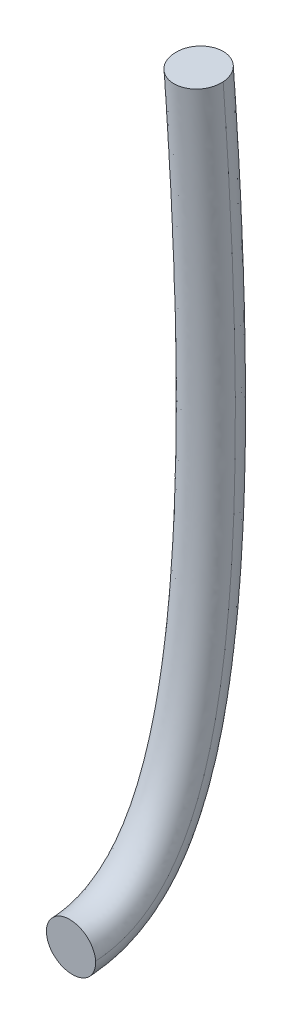
ISO-10303-21;
HEADER;
FILE_DESCRIPTION(('STEP AP214'),'2;1');
FILE_NAME('part.step','',(''),(''),'','','');
FILE_SCHEMA(('AUTOMOTIVE_DESIGN { 1 0 10303 214 1 1 1 1 }'));
ENDSEC;
DATA;
#1=APPLICATION_CONTEXT('core data for automotive mechanical design processes');
#2=APPLICATION_PROTOCOL_DEFINITION('international standard','automotive_design',2000,#1);
#3=PRODUCT_CONTEXT('',#1,'mechanical');
#4=PRODUCT('Part','Part','',(#3));
#5=PRODUCT_RELATED_PRODUCT_CATEGORY('part','',(#4));
#6=PRODUCT_DEFINITION_FORMATION('','',#4);
#7=PRODUCT_DEFINITION_CONTEXT('part definition',#1,'design');
#8=PRODUCT_DEFINITION('design','',#6,#7);
#9=PRODUCT_DEFINITION_SHAPE('','',#8);
#10=(LENGTH_UNIT() NAMED_UNIT(*) SI_UNIT(.MILLI.,.METRE.));
#11=(NAMED_UNIT(*) PLANE_ANGLE_UNIT() SI_UNIT($,.RADIAN.));
#12=(NAMED_UNIT(*) SI_UNIT($,.STERADIAN.) SOLID_ANGLE_UNIT());
#13=UNCERTAINTY_MEASURE_WITH_UNIT(LENGTH_MEASURE(1.E-05),#10,'distance_accuracy_value','');
#14=(GEOMETRIC_REPRESENTATION_CONTEXT(3) GLOBAL_UNCERTAINTY_ASSIGNED_CONTEXT((#13)) GLOBAL_UNIT_ASSIGNED_CONTEXT((#10,
#11,#12)) REPRESENTATION_CONTEXT('',''));
#15=CARTESIAN_POINT('',(0.,0.,0.));
#16=DIRECTION('',(0.,0.,1.));
#17=DIRECTION('',(1.,0.,0.));
#18=AXIS2_PLACEMENT_3D('',#15,#16,#17);
#19=CARTESIAN_POINT('',(-17.555,-7.38568943191456,11.1672900449514));
#20=CARTESIAN_POINT('',(-17.5550000000002,-7.37642950308164,10.9994364502612));
#21=CARTESIAN_POINT('',(-17.5550000000004,-7.27630738479391,10.6948035976056));
#22=CARTESIAN_POINT('',(-17.5550000000003,-6.87049354697238,10.3351990877175));
#23=CARTESIAN_POINT('',(-17.5549999999999,-6.18722129795571,10.0812514068247));
#24=CARTESIAN_POINT('',(-17.5549999999994,-5.06638830404402,9.90823800900155));
#25=CARTESIAN_POINT('',(-17.5549999999991,-3.38099110822586,9.86452211553343));
#26=CARTESIAN_POINT('',(-17.5549999999996,-1.83527381521949,9.93899557759439));
#27=CARTESIAN_POINT('',(-17.555,-1.00000001490137,10.0000001490162));
#28=CARTESIAN_POINT('',(-17.554999999999,-7.43610265920569,11.1645089135862));
#29=CARTESIAN_POINT('',(-17.5549999999992,-7.42638032085317,10.9882732782254));
#30=CARTESIAN_POINT('',(-17.5549999999994,-7.31962413810839,10.6638682837785));
#31=CARTESIAN_POINT('',(-17.5549999999992,-6.89389475712469,10.2891962403215));
#32=CARTESIAN_POINT('',(-17.5549999999989,-6.19822098452051,10.0317119787701));
#33=CARTESIAN_POINT('',(-17.5549999999984,-5.0694669059248,9.85763886137456));
#34=CARTESIAN_POINT('',(-17.5549999999981,-3.37989821810454,9.81402459070275));
#35=CARTESIAN_POINT('',(-17.5549999999985,-1.83238214013708,9.88858240859414));
#36=CARTESIAN_POINT('',(-17.554999999999,-0.996322261093757,9.94964439160444));
#37=CARTESIAN_POINT('',(-17.5785391100475,-7.50310010667755,11.1608128855284));
#38=CARTESIAN_POINT('',(-17.5785391100477,-7.49276364502284,10.9734451123601));
#39=CARTESIAN_POINT('',(-17.5785391100479,-7.37718524159239,10.6227654868779));
#40=CARTESIAN_POINT('',(-17.5785391100478,-6.92499936885807,10.2280770185193));
#41=CARTESIAN_POINT('',(-17.5785391100474,-6.21284579313548,9.9658864565508));
#42=CARTESIAN_POINT('',(-17.5785391100469,-5.0735639722797,9.79040143480988));
#43=CARTESIAN_POINT('',(-17.5785391100466,-3.37845106722099,9.74691896417055));
#44=CARTESIAN_POINT('',(-17.5785391100471,-1.82853851807828,9.82158508863255));
#45=CARTESIAN_POINT('',(-17.5785391100475,-0.991434652607267,9.88272331962833));
#46=CARTESIAN_POINT('',(-17.6505190833483,-7.57470774680984,11.1568625283572));
#47=CARTESIAN_POINT('',(-17.6505190833485,-7.56371553905938,10.9576081261052));
#48=CARTESIAN_POINT('',(-17.6505190833487,-7.43869873059526,10.5788488181541));
#49=CARTESIAN_POINT('',(-17.6505190833486,-6.9582525501853,10.1627788869149));
#50=CARTESIAN_POINT('',(-17.6505190833482,-6.22848737405222,9.89554822758815));
#51=CARTESIAN_POINT('',(-17.6505190833477,-5.07795197296071,9.7185485083637));
#52=CARTESIAN_POINT('',(-17.6505190833474,-3.37691263866721,9.67520177446663));
#53=CARTESIAN_POINT('',(-17.6505190833479,-1.82442932968597,9.74997766374041));
#54=CARTESIAN_POINT('',(-17.6505190833483,-0.986210720609659,9.81119731050171));
#55=CARTESIAN_POINT('',(-17.7438355847652,-7.61993836278091,11.1543673045539));
#56=CARTESIAN_POINT('',(-17.7438355847654,-7.60853107845988,10.9475888601949));
#57=CARTESIAN_POINT('',(-17.7438355847656,-7.47756512784935,10.5510890938704));
#58=CARTESIAN_POINT('',(-17.7438355847654,-6.97924541995067,10.1214966590491));
#59=CARTESIAN_POINT('',(-17.7438355847651,-6.23835292294597,9.85109617979233));
#60=CARTESIAN_POINT('',(-17.7438355847646,-5.08071119710778,9.67314749113105));
#61=CARTESIAN_POINT('',(-17.7438355847643,-3.37592943759194,9.62989357908475));
#62=CARTESIAN_POINT('',(-17.7438355847647,-1.82183527306593,9.70474707474506));
#63=CARTESIAN_POINT('',(-17.7438355847652,-0.982911049490704,9.76601825635647));
#64=CARTESIAN_POINT('',(-17.8850524391054,-7.60399735618256,11.1552467172762));
#65=CARTESIAN_POINT('',(-17.8850524391056,-7.59273655491606,10.9511235532875));
#66=CARTESIAN_POINT('',(-17.8850524391058,-7.46386452825342,10.5608771048295));
#67=CARTESIAN_POINT('',(-17.8850524391056,-6.9718492341243,10.1360542810496));
#68=CARTESIAN_POINT('',(-17.8850524391053,-6.23487910467969,9.86676793089808));
#69=CARTESIAN_POINT('',(-17.8850524391048,-5.07974149068369,9.68915197447507));
#70=CARTESIAN_POINT('',(-17.8850524391045,-3.37627848998266,9.64586378164126));
#71=CARTESIAN_POINT('',(-17.8850524391049,-1.82274918826266,9.72068809593831));
#72=CARTESIAN_POINT('',(-17.8850524391054,-0.984073980349695,9.78194109058665));
#73=CARTESIAN_POINT('',(-18.0119035373636,-7.47839292780554,11.1621758990434));
#74=CARTESIAN_POINT('',(-18.0119035373638,-7.46828329459383,10.9789198172507));
#75=CARTESIAN_POINT('',(-18.011903537364,-7.35595326720523,10.6379313313682));
#76=CARTESIAN_POINT('',(-18.0119035373639,-6.9135332397705,10.2506313244691));
#77=CARTESIAN_POINT('',(-18.0119035373635,-6.20745827499399,9.99017081405779));
#78=CARTESIAN_POINT('',(-18.011903537363,-5.07205807033013,9.81520333893958));
#79=CARTESIAN_POINT('',(-18.0119035373627,-3.3789893577195,9.77166941158744));
#80=CARTESIAN_POINT('',(-18.0119035373632,-1.82995536034777,9.84629226435053));
#81=CARTESIAN_POINT('',(-18.0119035373636,-0.993237094665954,9.90740233290438));
#82=CARTESIAN_POINT('',(-18.0119944293773,-7.3485287545302,11.1693400768776));
#83=CARTESIAN_POINT('',(-18.0119944293774,-7.33960959603295,11.0076635842821));
#84=CARTESIAN_POINT('',(-18.0119944293776,-7.24437876067712,10.717604825608));
#85=CARTESIAN_POINT('',(-18.0119944293775,-6.85324295469975,10.3691053368339));
#86=CARTESIAN_POINT('',(-18.0119944293771,-6.17911185334965,10.1177658240285));
#87=CARTESIAN_POINT('',(-18.0119944293766,-5.06411784279511,9.94553429265505));
#88=CARTESIAN_POINT('',(-18.0119944293764,-3.38179563445548,9.90174415021061));
#89=CARTESIAN_POINT('',(-18.0119944293768,-1.83740547018542,9.976156201868));
#90=CARTESIAN_POINT('',(-18.0119944293772,-1.00271096657219,10.0371184641126));
#91=CARTESIAN_POINT('',(-17.9828948609528,-7.28816581524924,11.1726701010151));
#92=CARTESIAN_POINT('',(-17.9828948609529,-7.27979984538482,11.0210211909464));
#93=CARTESIAN_POINT('',(-17.9828948609531,-7.19251932348195,10.7546346271501));
#94=CARTESIAN_POINT('',(-17.982894860953,-6.82521696261271,10.4241670798163));
#95=CARTESIAN_POINT('',(-17.9828948609526,-6.16593331407854,10.1770697024865));
#96=CARTESIAN_POINT('',(-17.9828948609521,-5.06042478911119,10.0061113265432));
#97=CARTESIAN_POINT('',(-17.9828948609519,-3.38309790841542,9.96220340685519));
#98=CARTESIAN_POINT('',(-17.9828948609523,-1.84086867718057,10.0365190113268));
#99=CARTESIAN_POINT('',(-17.9828948609527,-1.0071145733577,10.0974125910793));
#100=B_SPLINE_SURFACE_WITH_KNOTS('',3,3,((#19,#20,#21,#22,#23,#24,#25,#26,#27),(#28,#29,#30,#31,
#32,#33,#34,#35,#36),(#37,#38,#39,#40,#41,#42,#43,#44,#45),(#46,#47,#48,#49,#50,#51,#52,#53,
#54),(#55,#56,#57,#58,#59,#60,#61,#62,#63),(#64,#65,#66,#67,#68,#69,#70,#71,#72),(#73,#74,#75,
#76,#77,#78,#79,#80,#81),(#82,#83,#84,#85,#86,#87,#88,#89,#90),(#91,#92,#93,#94,#95,#96,#97,#98,
#99)),.UNSPECIFIED.,.F.,.F.,.F.,(4,1,1,1,1,1,4),(4,1,1,1,1,1,4),(-3.14159265358979,
-2.46839422782055,-2.24399475256414,-1.79519580205131,-1.12199737628207,-0.448798950512828,
0.448798950512828),(0.,0.142857142857143,0.285714285714286,0.428571428571429,0.571428571428571,
0.785714285714286,1.),.UNSPECIFIED.);
#101=CARTESIAN_POINT('',(-17.555,-7.38568943191456,11.1672900449514));
#102=CARTESIAN_POINT('',(-17.5550000000002,-7.37642950308164,10.9994364502612));
#103=CARTESIAN_POINT('',(-17.5550000000004,-7.27630738479391,10.6948035976056));
#104=CARTESIAN_POINT('',(-17.5550000000003,-6.87049354697238,10.3351990877175));
#105=CARTESIAN_POINT('',(-17.5549999999999,-6.18722129795571,10.0812514068247));
#106=CARTESIAN_POINT('',(-17.5549999999994,-5.06638830404402,9.90823800900155));
#107=CARTESIAN_POINT('',(-17.5549999999991,-3.38099110822586,9.86452211553343));
#108=CARTESIAN_POINT('',(-17.5549999999996,-1.83527381521949,9.93899557759439));
#109=CARTESIAN_POINT('',(-17.555,-1.00000001490137,10.0000001490162));
#110=B_SPLINE_CURVE_WITH_KNOTS('',3,(#101,#102,#103,#104,#105,#106,#107,#108,#109),
.UNSPECIFIED.,.F.,.F.,(4,1,1,1,1,1,4),(0.,0.142857142857143,0.285714285714286,0.428571428571429,
0.571428571428571,0.785714285714286,1.),.UNSPECIFIED.);
#111=CARTESIAN_POINT('',(-17.555,-7.38568943191456,11.1672900449514));
#112=VERTEX_POINT('',#111);
#113=CARTESIAN_POINT('',(-17.555,-1.00000001490137,10.0000001490162));
#114=VERTEX_POINT('',#113);
#115=EDGE_CURVE('E11',#112,#114,#110,.T.);
#116=CARTESIAN_POINT('',(-17.555,-7.38568943191456,11.1672900449514));
#117=CARTESIAN_POINT('',(-17.5549787274771,-7.41102471275125,11.1658923811246));
#118=CARTESIAN_POINT('',(-17.5594742792876,-7.43643253137826,11.1644907156271));
#119=CARTESIAN_POINT('',(-17.5764203979954,-7.48437601313137,11.1618458319721));
#120=CARTESIAN_POINT('',(-17.5888657028604,-7.50691356429395,11.1606025096577));
#121=CARTESIAN_POINT('',(-17.62068241915,-7.54639939321398,11.1584242067957));
#122=CARTESIAN_POINT('',(-17.6400432100441,-7.5633561654056,11.1574887576383));
#123=CARTESIAN_POINT('',(-17.6830889643929,-7.58996281842432,11.1560209564043));
#124=CARTESIAN_POINT('',(-17.7067443116465,-7.59966054680912,11.1554859647358));
#125=CARTESIAN_POINT('',(-17.7560076016807,-7.61052235072792,11.1548867548621));
#126=CARTESIAN_POINT('',(-17.7816204807639,-7.61166408187141,11.1548237693232));
#127=CARTESIAN_POINT('',(-17.8318892542796,-7.60564134921908,11.1551560236061));
#128=CARTESIAN_POINT('',(-17.8565434788333,-7.59846300864074,11.1555520289644));
#129=CARTESIAN_POINT('',(-17.9020065070542,-7.57620555302376,11.156779899332));
#130=CARTESIAN_POINT('',(-17.9228097887315,-7.5611152096526,11.1576123837715));
#131=CARTESIAN_POINT('',(-17.9585076077076,-7.52495357970437,11.1596073015475));
#132=CARTESIAN_POINT('',(-17.9733789898422,-7.50385939534189,11.1607709980792));
#133=CARTESIAN_POINT('',(-17.9945562726862,-7.45822998378213,11.1632882221191));
#134=CARTESIAN_POINT('',(-18.0010306892592,-7.43377371561457,11.1646373937181));
#135=CARTESIAN_POINT('',(-18.0047933580637,-7.39652794522938,11.1666921199439));
#136=CARTESIAN_POINT('',(-18.0050376426428,-7.38393459611462,11.1673868534513));
#137=CARTESIAN_POINT('',(-18.0035025302005,-7.35885995780879,11.16877013849));
#138=CARTESIAN_POINT('',(-18.0017241531995,-7.34637861533123,11.1694586929609));
#139=CARTESIAN_POINT('',(-17.9960058832831,-7.32135945624952,11.1708389173939));
#140=CARTESIAN_POINT('',(-17.9919782108732,-7.3088413503883,11.1715294999793));
#141=CARTESIAN_POINT('',(-17.981666296378,-7.28477231923517,11.1728573089903));
#142=CARTESIAN_POINT('',(-17.9753834815006,-7.27322078791775,11.1734945688482));
#143=CARTESIAN_POINT('',(-17.9613882215489,-7.25221068569533,11.1746536268458));
#144=CARTESIAN_POINT('',(-17.9538105464108,-7.24266144101503,11.1751804271583));
#145=CARTESIAN_POINT('',(-17.9372451544926,-7.22485205074891,11.176162912441));
#146=CARTESIAN_POINT('',(-17.9282555430136,-7.2165936675374,11.1766185001866));
#147=CARTESIAN_POINT('',(-17.9085042664574,-7.20109346442636,11.1774735952352));
#148=CARTESIAN_POINT('',(-17.8976669355207,-7.19394752816238,11.1778678129543));
#149=CARTESIAN_POINT('',(-17.8749582710206,-7.1815732741487,11.1785504597081));
#150=CARTESIAN_POINT('',(-17.8630884396757,-7.17634222626356,11.1788390393552));
#151=CARTESIAN_POINT('',(-17.8386530200918,-7.16811186531233,11.1792930812053));
#152=CARTESIAN_POINT('',(-17.8260911170509,-7.16510176652688,11.1794591384208));
#153=CARTESIAN_POINT('',(-17.8006273173911,-7.16139489732678,11.1796636341603));
#154=CARTESIAN_POINT('',(-17.7877252116967,-7.16069958454093,11.1797019922718));
#155=CARTESIAN_POINT('',(-17.7627092575343,-7.1614527433657,11.1796604429851));
#156=CARTESIAN_POINT('',(-17.750591327366,-7.16278461841239,11.1795869678346));
#157=CARTESIAN_POINT('',(-17.7267024472358,-7.16730519940402,11.179337582301));
#158=CARTESIAN_POINT('',(-17.714931678428,-7.1704948573672,11.1791616193983));
#159=CARTESIAN_POINT('',(-17.6911222318988,-7.17899075575905,11.178692928724));
#160=CARTESIAN_POINT('',(-17.6791354553194,-7.18444389803626,11.1783920968622));
#161=CARTESIAN_POINT('',(-17.6563290996798,-7.1973674463301,11.1776791473559));
#162=CARTESIAN_POINT('',(-17.6455078855712,-7.20483497361077,11.1772671885217));
#163=CARTESIAN_POINT('',(-17.616456190345,-7.22919786630976,11.1759231681389));
#164=CARTESIAN_POINT('',(-17.6002418441554,-7.24855625463276,11.1748552297458));
#165=CARTESIAN_POINT('',(-17.5746441856777,-7.29145024800525,11.1724889096994));
#166=CARTESIAN_POINT('',(-17.565304015267,-7.31501110069237,11.1711891352171));
#167=CARTESIAN_POINT('',(-17.5567288082222,-7.35460631274691,11.1690047980487));
#168=CARTESIAN_POINT('',(-17.5550130607995,-7.3701342002111,11.1681481757458));
#169=CARTESIAN_POINT('',(-17.555,-7.38568943191456,11.1672900449514));
#170=B_SPLINE_CURVE_WITH_KNOTS('',3,(#116,#117,#118,#119,#120,#121,#122,#123,#124,#125,#126,
#127,#128,#129,#130,#131,#132,#133,#134,#135,#136,#137,#138,#139,#140,#141,#142,#143,#144,#145,
#146,#147,#148,#149,#150,#151,#152,#153,#154,#155,#156,#157,#158,#159,#160,#161,#162,#163,#164,
#165,#166,#167,#168,#169),.UNSPECIFIED.,.T.,.F.,(4,2,2,2,2,2,2,2,2,2,2,2,2,2,2,2,2,2,2,2,2,2,2,
2,2,2,4),(0.,0.0759486066991361,0.151846994167119,0.22762931754208,0.302907617824893,
0.378382442656022,0.453983330905396,0.529691799852845,0.605692970633187,0.680144014351659,
0.717867994614961,0.755572959255371,0.794864022626056,0.834130263649931,0.87058168483875,
0.907082445377708,0.945866090842245,0.984594223488995,1.02313301781127,1.06169607556072,
1.09812339418813,1.13456939638829,1.17388556286447,1.21314583799461,1.28747622307097,
1.36226921307141,1.40889976681879),.UNSPECIFIED.);
#171=CARTESIAN_POINT('',(-17.9828948609528,-7.28816581524924,11.1726701010151));
#172=VERTEX_POINT('',#171);
#173=EDGE_CURVE('E47',#112,#172,#170,.T.);
#174=CARTESIAN_POINT('',(-17.9828948609528,-7.28816581524924,11.1726701010151));
#175=CARTESIAN_POINT('',(-17.9828948609529,-7.27979984538482,11.0210211909464));
#176=CARTESIAN_POINT('',(-17.9828948609531,-7.19251932348195,10.7546346271501));
#177=CARTESIAN_POINT('',(-17.982894860953,-6.82521696261271,10.4241670798163));
#178=CARTESIAN_POINT('',(-17.9828948609526,-6.16593331407854,10.1770697024865));
#179=CARTESIAN_POINT('',(-17.9828948609521,-5.06042478911119,10.0061113265432));
#180=CARTESIAN_POINT('',(-17.9828948609519,-3.38309790841542,9.96220340685519));
#181=CARTESIAN_POINT('',(-17.9828948609523,-1.84086867718057,10.0365190113268));
#182=CARTESIAN_POINT('',(-17.9828948609527,-1.0071145733577,10.0974125910793));
#183=B_SPLINE_CURVE_WITH_KNOTS('',3,(#174,#175,#176,#177,#178,#179,#180,#181,#182),
.UNSPECIFIED.,.F.,.F.,(4,1,1,1,1,1,4),(0.,0.142857142857143,0.285714285714286,0.428571428571429,
0.571428571428571,0.785714285714286,1.),.UNSPECIFIED.);
#184=CARTESIAN_POINT('',(-17.9828948609527,-1.0071145733577,10.0974125910793));
#185=VERTEX_POINT('',#184);
#186=EDGE_CURVE('E29',#172,#185,#183,.T.);
#187=CARTESIAN_POINT('',(-17.555,-1.00000001490137,10.0000001490162));
#188=CARTESIAN_POINT('',(-17.5550109258887,-1.00092580970206,10.0126761194143));
#189=CARTESIAN_POINT('',(-17.556153025859,-1.00185188551025,10.0253559373633));
#190=CARTESIAN_POINT('',(-17.5605838617681,-1.00367793175485,10.0503581388496));
#191=CARTESIAN_POINT('',(-17.5638776976219,-1.00457783485198,10.0626796003785));
#192=CARTESIAN_POINT('',(-17.5724215761546,-1.00632384922809,10.08658600656));
#193=CARTESIAN_POINT('',(-17.5776659177798,-1.00717010894382,10.0981729836068));
#194=CARTESIAN_POINT('',(-17.5899672644214,-1.00878880821922,10.1203361930814));
#195=CARTESIAN_POINT('',(-17.5970229824559,-1.00956129965875,10.1309131358476));
#196=CARTESIAN_POINT('',(-17.6130475330382,-1.0110319588652,10.1510493826191));
#197=CARTESIAN_POINT('',(-17.6220672831449,-1.01172721185437,10.1605687775253));
#198=CARTESIAN_POINT('',(-17.6417147706393,-1.01298383289045,10.1777744164453));
#199=CARTESIAN_POINT('',(-17.6523414284897,-1.01354529017526,10.1854618823034));
#200=CARTESIAN_POINT('',(-17.6740020608389,-1.01448716523158,10.1983580233527));
#201=CARTESIAN_POINT('',(-17.6849560468646,-1.0148774723909,10.2037021039135));
#202=CARTESIAN_POINT('',(-17.7075797325245,-1.01552888253597,10.2126212031671));
#203=CARTESIAN_POINT('',(-17.7192503909068,-1.01578980801122,10.2161937913883));
#204=CARTESIAN_POINT('',(-17.7437367343103,-1.01618882320902,10.2216571022989));
#205=CARTESIAN_POINT('',(-17.7565787359315,-1.01631839245544,10.2234311627395));
#206=CARTESIAN_POINT('',(-17.7823669991049,-1.01641929348824,10.2248126983711));
#207=CARTESIAN_POINT('',(-17.7953130877931,-1.01639084849847,10.2244232299402));
#208=CARTESIAN_POINT('',(-17.8208883822237,-1.01616582126333,10.2213421599564));
#209=CARTESIAN_POINT('',(-17.8335185520129,-1.01596983795987,10.2186587591084));
#210=CARTESIAN_POINT('',(-17.8580869140907,-1.01541487196054,10.2110601718465));
#211=CARTESIAN_POINT('',(-17.8700246885338,-1.01505579197012,10.2061436532771));
#212=CARTESIAN_POINT('',(-17.8922673547766,-1.01422128741594,10.1947176277495));
#213=CARTESIAN_POINT('',(-17.9026259968799,-1.01375337428598,10.1883109672455));
#214=CARTESIAN_POINT('',(-17.9222313573681,-1.01270636685299,10.1739753550587));
#215=CARTESIAN_POINT('',(-17.931477438799,-1.01212720934921,10.166045538032));
#216=CARTESIAN_POINT('',(-17.949312424714,-1.01082039445981,10.1481526455233));
#217=CARTESIAN_POINT('',(-17.9577894691079,-1.01008456079276,10.1380776205021));
#218=CARTESIAN_POINT('',(-17.9728211066353,-1.00851723873657,10.116617867246));
#219=CARTESIAN_POINT('',(-17.9793785168292,-1.00768589303325,10.1052350926635));
#220=CARTESIAN_POINT('',(-17.9951268221104,-1.00516538945402,10.0707243903624));
#221=CARTESIAN_POINT('',(-18.0014235725758,-1.00337431205483,10.0462009818535));
#222=CARTESIAN_POINT('',(-18.0048744485045,-1.00065795556197,10.0090086640003));
#223=CARTESIAN_POINT('',(-18.0050135929016,-0.999743678836448,9.9964903989381));
#224=CARTESIAN_POINT('',(-18.0032930383759,-0.997924210617663,9.97157826369573));
#225=CARTESIAN_POINT('',(-18.0014346483117,-0.997019013567095,9.95918431742509));
#226=CARTESIAN_POINT('',(-17.9955671605391,-0.995200063989507,9.9342792834113));
#227=CARTESIAN_POINT('',(-17.9914591451676,-0.99428798500062,9.92179110973054));
#228=CARTESIAN_POINT('',(-17.9810064873987,-0.992534323158183,9.8977799945393));
#229=CARTESIAN_POINT('',(-17.9746621518833,-0.991692730651636,9.8862569208601));
#230=CARTESIAN_POINT('',(-17.9605118913823,-0.990157308789329,9.86523394464496));
#231=CARTESIAN_POINT('',(-17.9528285978137,-0.989457416868279,9.85565103354375));
#232=CARTESIAN_POINT('',(-17.9360265426204,-0.988155671749476,9.83782755626852));
#233=CARTESIAN_POINT('',(-17.9269072291485,-0.98755385642318,9.82958750863002));
#234=CARTESIAN_POINT('',(-17.907039707438,-0.986440068511395,9.81433753899439));
#235=CARTESIAN_POINT('',(-17.8962379650898,-0.985933131516256,9.807396564235));
#236=CARTESIAN_POINT('',(-17.8735897841357,-0.985064188738059,9.79549901099141));
#237=CARTESIAN_POINT('',(-17.8617437274281,-0.984702130240072,9.79054171073507));
#238=CARTESIAN_POINT('',(-17.8376323125895,-0.984135807464393,9.78278762663919));
#239=CARTESIAN_POINT('',(-17.8253803751681,-0.983928484835537,9.77994896789519));
#240=CARTESIAN_POINT('',(-17.8005742525679,-0.983661570210727,9.77629437631594));
#241=CARTESIAN_POINT('',(-17.7880199688381,-0.983602027060598,9.77547911227708));
#242=CARTESIAN_POINT('',(-17.7626182732445,-0.983634269388104,9.7759205738071));
#243=CARTESIAN_POINT('',(-17.7497716396555,-0.983729991953859,9.77723120593544));
#244=CARTESIAN_POINT('',(-17.7245133511483,-0.9840848535487,9.78208996628754));
#245=CARTESIAN_POINT('',(-17.7121015744108,-0.984343946419142,9.78563746250776));
#246=CARTESIAN_POINT('',(-17.6884354825134,-0.985002490988234,9.79465424620273));
#247=CARTESIAN_POINT('',(-17.6771575704743,-0.985397482202726,9.80006246078628));
#248=CARTESIAN_POINT('',(-17.6556309092793,-0.986315656751378,9.81263409479245));
#249=CARTESIAN_POINT('',(-17.6453823510939,-0.986838863811057,9.81979783906458));
#250=CARTESIAN_POINT('',(-17.6259595965394,-0.988016645646908,9.83592401267842));
#251=CARTESIAN_POINT('',(-17.6168195695772,-0.988674237227378,9.84492774806543));
#252=CARTESIAN_POINT('',(-17.6002613544678,-0.990094366176442,9.8643721352087));
#253=CARTESIAN_POINT('',(-17.5928430793332,-0.990856898240072,9.87481271432945));
#254=CARTESIAN_POINT('',(-17.5737488902606,-0.99322639091393,9.90725577727379));
#255=CARTESIAN_POINT('',(-17.56466578781,-0.994950891051672,9.93086761078285));
#256=CARTESIAN_POINT('',(-17.5565627372199,-0.997806130586165,9.96996151344));
#257=CARTESIAN_POINT('',(-17.5549870519646,-0.998902875418758,9.98497812945669));
#258=CARTESIAN_POINT('',(-17.555,-1.00000001490137,10.0000001490162));
#259=B_SPLINE_CURVE_WITH_KNOTS('',3,(#187,#188,#189,#190,#191,#192,#193,#194,#195,#196,#197,
#198,#199,#200,#201,#202,#203,#204,#205,#206,#207,#208,#209,#210,#211,#212,#213,#214,#215,#216,
#217,#218,#219,#220,#221,#222,#223,#224,#225,#226,#227,#228,#229,#230,#231,#232,#233,#234,#235,
#236,#237,#238,#239,#240,#241,#242,#243,#244,#245,#246,#247,#248,#249,#250,#251,#252,#253,#254,
#255,#256,#257,#258),.UNSPECIFIED.,.T.,.F.,(4,2,2,2,2,2,2,2,2,2,2,2,2,2,2,2,2,2,2,2,2,2,2,2,2,2,
2,2,2,2,2,2,2,2,2,4),(0.,0.0380918255708382,0.0762742632659994,0.114345965073647,
0.15239069146182,0.191573550114242,0.230730201314762,0.267158188720048,0.303636017659137,
0.342352332765453,0.381013967954734,0.419537964786901,0.458084973167221,0.494505402028658,
0.530946583789764,0.570304953116588,0.609605271178384,0.684072743104435,0.721620326586813,
0.759143322491429,0.798466764459899,0.837784812317694,0.874533043301786,0.911295430857217,
0.949654046008316,0.987998691423067,1.02556378037019,1.063141284123,1.10168662645715,
1.14022108306781,1.17759541961075,1.21497667726386,1.25331370849421,1.29164880241769,
1.36617745671819,1.41131925894817),.UNSPECIFIED.);
#260=EDGE_CURVE('E48',#185,#114,#259,.T.);
#261=ORIENTED_EDGE('',*,*,#115,.F.);
#262=ORIENTED_EDGE('',*,*,#173,.T.);
#263=ORIENTED_EDGE('',*,*,#186,.T.);
#264=ORIENTED_EDGE('',*,*,#260,.T.);
#265=EDGE_LOOP('',(#261,#262,#263,#264));
#266=FACE_BOUND('',#265,.T.);
#267=ADVANCED_FACE('F17',(#266),#100,.T.);
#268=CARTESIAN_POINT('',(-17.78,-7.38568943191911,11.1672900449514));
#269=DIRECTION('',(-1.11249196396045E-12,0.0550829445172842,-0.998481782118886));
#270=DIRECTION('',(0.,0.998481782118886,0.0550829445172842));
#271=AXIS2_PLACEMENT_3D('',#268,#269,#270);
#272=PLANE('',#271);
#273=ORIENTED_EDGE('',*,*,#173,.F.);
#274=EDGE_CURVE('E50',#172,#112,#170,.T.);
#275=ORIENTED_EDGE('',*,*,#274,.F.);
#276=EDGE_LOOP('',(#273,#275));
#277=FACE_BOUND('',#276,.T.);
#278=ADVANCED_FACE('F54',(#277),#272,.F.);
#279=CARTESIAN_POINT('',(-17.78,-1.00000001490116,10.0000001490116));
#280=DIRECTION('',(-5.32623886368089E-13,0.997343536648528,0.0728414024124084));
#281=DIRECTION('',(0.,-0.0728414024124084,0.997343536648528));
#282=AXIS2_PLACEMENT_3D('',#279,#280,#281);
#283=PLANE('',#282);
#284=EDGE_CURVE('E56',#114,#185,#259,.T.);
#285=ORIENTED_EDGE('',*,*,#284,.F.);
#286=ORIENTED_EDGE('',*,*,#260,.F.);
#287=EDGE_LOOP('',(#285,#286));
#288=FACE_BOUND('',#287,.T.);
#289=ADVANCED_FACE('F84',(#288),#283,.T.);
#290=CARTESIAN_POINT('',(-17.9828948609528,-7.28816581524924,11.1726701010151));
#291=CARTESIAN_POINT('',(-17.9828948609529,-7.27979984538482,11.0210211909464));
#292=CARTESIAN_POINT('',(-17.9828948609531,-7.19251932348195,10.7546346271501));
#293=CARTESIAN_POINT('',(-17.982894860953,-6.82521696261271,10.4241670798163));
#294=CARTESIAN_POINT('',(-17.9828948609526,-6.16593331407854,10.1770697024865));
#295=CARTESIAN_POINT('',(-17.9828948609521,-5.06042478911119,10.0061113265432));
#296=CARTESIAN_POINT('',(-17.9828948609519,-3.38309790841542,9.96220340685519));
#297=CARTESIAN_POINT('',(-17.9828948609523,-1.84086867718057,10.0365190113268));
#298=CARTESIAN_POINT('',(-17.9828948609527,-1.0071145733577,10.0974125910793));
#299=CARTESIAN_POINT('',(-17.9537952925283,-7.22780287596828,11.1760001251526));
#300=CARTESIAN_POINT('',(-17.9537952925284,-7.21999009473669,11.0343787976106));
#301=CARTESIAN_POINT('',(-17.9537952925286,-7.14065988628679,10.7916644286922));
#302=CARTESIAN_POINT('',(-17.9537952925285,-6.79719097052566,10.4792288227987));
#303=CARTESIAN_POINT('',(-17.9537952925281,-6.15275477480742,10.2363735809446));
#304=CARTESIAN_POINT('',(-17.9537952925276,-5.05673173542727,10.0666883604314));
#305=CARTESIAN_POINT('',(-17.9537952925274,-3.38440018237537,10.0226626634998));
#306=CARTESIAN_POINT('',(-17.9537952925278,-1.84433188417572,10.0968818207855));
#307=CARTESIAN_POINT('',(-17.9537952925282,-1.01151818014321,10.157706718046));
#308=CARTESIAN_POINT('',(-17.8372931422432,-7.13476731687341,11.1811325898919));
#309=CARTESIAN_POINT('',(-17.8372931422434,-7.12780674764234,11.0549592048029));
#310=CARTESIAN_POINT('',(-17.8372931422436,-7.06073585925256,10.8487282128721));
#311=CARTESIAN_POINT('',(-17.8372931422435,-6.75399018511548,10.5640769234541));
#312=CARTESIAN_POINT('',(-17.8372931422431,-6.13243652817361,10.327766226239));
#313=CARTESIAN_POINT('',(-17.8372931422426,-5.05103406644591,10.1600468345949));
#314=CARTESIAN_POINT('',(-17.8372931422424,-3.3864021048026,10.1158428459373));
#315=CARTESIAN_POINT('',(-17.8372931422428,-1.84967030091329,10.1899171300291));
#316=CARTESIAN_POINT('',(-17.8372931422433,-1.01830532510668,10.2506362188175));
#317=CARTESIAN_POINT('',(-17.6193944079575,-7.18477640782297,11.1783737533946));
#318=CARTESIAN_POINT('',(-17.6193944079577,-7.17735849766137,11.0439102053286));
#319=CARTESIAN_POINT('',(-17.6193944079579,-7.10368721033171,10.8180718793657));
#320=CARTESIAN_POINT('',(-17.6193944079577,-6.77722139184719,10.5185002285866));
#321=CARTESIAN_POINT('',(-17.6193944079574,-6.14337034316558,10.2786599971527));
#322=CARTESIAN_POINT('',(-17.6193944079569,-5.05410727978171,10.1098773088842));
#323=CARTESIAN_POINT('',(-17.6193944079566,-3.3853357544798,10.0657631380452));
#324=CARTESIAN_POINT('',(-17.619394407957,-1.84679949203958,10.1399082659676));
#325=CARTESIAN_POINT('',(-17.6193944079575,-1.01465705391788,10.2006841370415));
#326=CARTESIAN_POINT('',(-17.5550000000014,-7.31847179552639,11.1709982201049));
#327=CARTESIAN_POINT('',(-17.5550000000015,-7.30982729388697,11.0143003987002));
#328=CARTESIAN_POINT('',(-17.5550000000017,-7.21856663037596,10.7360252213707));
#329=CARTESIAN_POINT('',(-17.5550000000016,-6.83927747920377,10.396489078144));
#330=CARTESIAN_POINT('',(-17.5550000000013,-6.1725367206153,10.1472743428811));
#331=CARTESIAN_POINT('',(-17.5550000000008,-5.06226765115461,9.97568382362931));
#332=CARTESIAN_POINT('',(-17.5550000000005,-3.38243368726151,9.93184146326353));
#333=CARTESIAN_POINT('',(-17.5550000000009,-1.83913128396928,10.00621299735));
#334=CARTESIAN_POINT('',(-17.5550000000014,-1.00490368664486,10.0671411588984));
#335=CARTESIAN_POINT('',(-17.555,-7.38568943191456,11.1672900449514));
#336=CARTESIAN_POINT('',(-17.5550000000002,-7.37642950308164,10.9994364502612));
#337=CARTESIAN_POINT('',(-17.5550000000004,-7.27630738479391,10.6948035976056));
#338=CARTESIAN_POINT('',(-17.5550000000003,-6.87049354697238,10.3351990877175));
#339=CARTESIAN_POINT('',(-17.5549999999999,-6.18722129795571,10.0812514068247));
#340=CARTESIAN_POINT('',(-17.5549999999994,-5.06638830404402,9.90823800900155));
#341=CARTESIAN_POINT('',(-17.5549999999991,-3.38099110822586,9.86452211553343));
#342=CARTESIAN_POINT('',(-17.5549999999996,-1.83527381521949,9.93899557759439));
#343=CARTESIAN_POINT('',(-17.555,-1.00000001490137,10.0000001490162));
#344=B_SPLINE_SURFACE_WITH_KNOTS('',3,3,((#290,#291,#292,#293,#294,#295,#296,#297,#298),(#299,
#300,#301,#302,#303,#304,#305,#306,#307),(#308,#309,#310,#311,#312,#313,#314,#315,#316),(#317,
#318,#319,#320,#321,#322,#323,#324,#325),(#326,#327,#328,#329,#330,#331,#332,#333,#334),(#335,
#336,#337,#338,#339,#340,#341,#342,#343)),.UNSPECIFIED.,.F.,.F.,.F.,(4,1,1,4),(4,1,1,1,1,1,4),
(0.448798950512828,1.34639685153848,2.24399475256414,3.14159265358979),(0.,0.142857142857143,
0.285714285714286,0.428571428571429,0.571428571428571,0.785714285714286,1.),.UNSPECIFIED.);
#345=ORIENTED_EDGE('',*,*,#274,.T.);
#346=ORIENTED_EDGE('',*,*,#115,.T.);
#347=ORIENTED_EDGE('',*,*,#284,.T.);
#348=ORIENTED_EDGE('',*,*,#186,.F.);
#349=EDGE_LOOP('',(#345,#346,#347,#348));
#350=FACE_BOUND('',#349,.T.);
#351=ADVANCED_FACE('F51',(#350),#344,.T.);
#352=CLOSED_SHELL('',(#267,#278,#289,#351));
#353=MANIFOLD_SOLID_BREP('B1',#352);
#354=ADVANCED_BREP_SHAPE_REPRESENTATION('',(#18,#353),#14);
#355=SHAPE_DEFINITION_REPRESENTATION(#9,#354);
ENDSEC;
END-ISO-10303-21;
